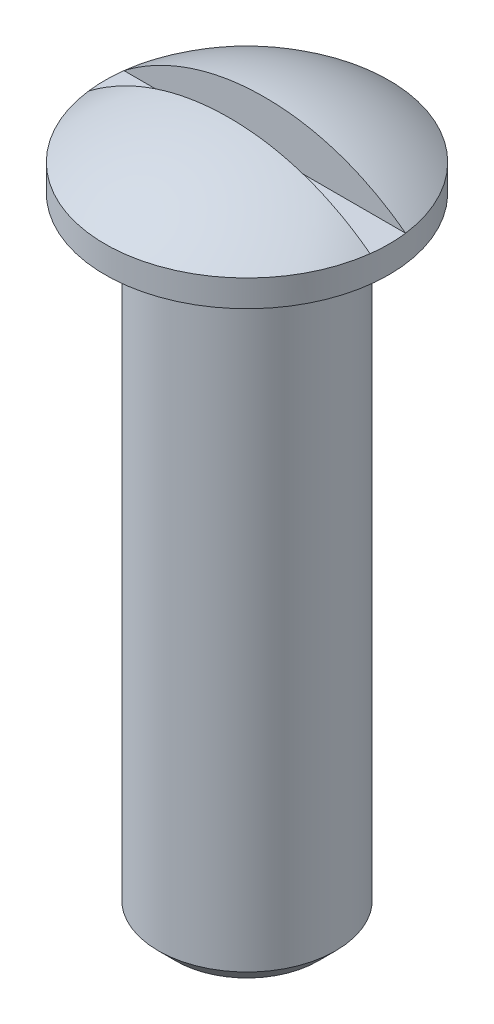
ISO-10303-21;
HEADER;
FILE_DESCRIPTION(('STEP AP214'),'2;1');
FILE_NAME('part.step','',(''),(''),'','','');
FILE_SCHEMA(('AUTOMOTIVE_DESIGN { 1 0 10303 214 1 1 1 1 }'));
ENDSEC;
DATA;
#1=APPLICATION_CONTEXT('core data for automotive mechanical design processes');
#2=APPLICATION_PROTOCOL_DEFINITION('international standard','automotive_design',2000,#1);
#3=PRODUCT_CONTEXT('',#1,'mechanical');
#4=PRODUCT('Part','Part','',(#3));
#5=PRODUCT_RELATED_PRODUCT_CATEGORY('part','',(#4));
#6=PRODUCT_DEFINITION_FORMATION('','',#4);
#7=PRODUCT_DEFINITION_CONTEXT('part definition',#1,'design');
#8=PRODUCT_DEFINITION('design','',#6,#7);
#9=PRODUCT_DEFINITION_SHAPE('','',#8);
#10=(LENGTH_UNIT() NAMED_UNIT(*) SI_UNIT(.MILLI.,.METRE.));
#11=(NAMED_UNIT(*) PLANE_ANGLE_UNIT() SI_UNIT($,.RADIAN.));
#12=(NAMED_UNIT(*) SI_UNIT($,.STERADIAN.) SOLID_ANGLE_UNIT());
#13=UNCERTAINTY_MEASURE_WITH_UNIT(LENGTH_MEASURE(1.E-05),#10,'distance_accuracy_value','');
#14=(GEOMETRIC_REPRESENTATION_CONTEXT(3) GLOBAL_UNCERTAINTY_ASSIGNED_CONTEXT((#13)) GLOBAL_UNIT_ASSIGNED_CONTEXT((#10,
#11,#12)) REPRESENTATION_CONTEXT('',''));
#15=CARTESIAN_POINT('',(0.,0.,0.));
#16=DIRECTION('',(0.,0.,1.));
#17=DIRECTION('',(1.,0.,0.));
#18=AXIS2_PLACEMENT_3D('',#15,#16,#17);
#19=CARTESIAN_POINT('',(0.,26.7001788182341,0.));
#20=DIRECTION('',(0.,-1.,0.));
#21=DIRECTION('',(1.,0.,0.));
#22=AXIS2_PLACEMENT_3D('',#19,#20,#21);
#23=DEGENERATE_TOROIDAL_SURFACE('',#22,0.0681853511540249,13.,.T.);
#24=CARTESIAN_POINT('',(0.,37.,0.));
#25=DIRECTION('',(0.,-1.,0.));
#26=DIRECTION('',(1.,0.,0.));
#27=AXIS2_PLACEMENT_3D('',#24,#25,#26);
#28=CIRCLE('',#27,8.);
#29=CARTESIAN_POINT('',(-7.93725393319377,37.,-0.99999999999999));
#30=VERTEX_POINT('',#29);
#31=CARTESIAN_POINT('',(7.93725393319377,37.,-1.));
#32=VERTEX_POINT('',#31);
#33=EDGE_CURVE('E96',#30,#32,#28,.T.);
#34=ORIENTED_EDGE('',*,*,#33,.F.);
#35=CARTESIAN_POINT('',(-11.5955884343701,20.7735568842803,-0.999999999999988));
#36=CARTESIAN_POINT('',(-11.7504543959535,21.0747175937025,-0.999999999999988));
#37=CARTESIAN_POINT('',(-11.8934649747058,21.3819681700214,-0.999999999999988));
#38=CARTESIAN_POINT('',(-12.1550036979689,22.0066856029269,-0.999999999999988));
#39=CARTESIAN_POINT('',(-12.2735341060582,22.3241515118044,-0.999999999999988));
#40=CARTESIAN_POINT('',(-12.4853594784374,22.9673613933858,-0.999999999999988));
#41=CARTESIAN_POINT('',(-12.5786568895041,23.2931045601125,-0.999999999999987));
#42=CARTESIAN_POINT('',(-12.7394709562751,23.9509052297831,-0.999999999999987));
#43=CARTESIAN_POINT('',(-12.8069862709557,24.2829630602334,-0.999999999999987));
#44=CARTESIAN_POINT('',(-12.9199617626316,24.9768406525739,-0.999999999999987));
#45=CARTESIAN_POINT('',(-12.9633487172013,25.3389998147488,-0.999999999999987));
#46=CARTESIAN_POINT('',(-13.0194582584367,26.0656887723323,-0.999999999999987));
#47=CARTESIAN_POINT('',(-13.0321800022219,26.4302186326269,-0.999999999999987));
#48=CARTESIAN_POINT('',(-13.0268684335726,27.1590332231517,-0.999999999999987));
#49=CARTESIAN_POINT('',(-13.0088370481099,27.5233179673098,-0.999999999999987));
#50=CARTESIAN_POINT('',(-12.9421510824588,28.2490674187462,-0.999999999999987));
#51=CARTESIAN_POINT('',(-12.8934969803872,28.6105321699642,-0.999999999999987));
#52=CARTESIAN_POINT('',(-12.7659128451296,29.3280740617672,-0.999999999999987));
#53=CARTESIAN_POINT('',(-12.6869831764751,29.6841512671671,-0.999999999999987));
#54=CARTESIAN_POINT('',(-12.4994085889598,30.388392558344,-0.999999999999987));
#55=CARTESIAN_POINT('',(-12.3907635460108,30.73655661107,-0.999999999999988));
#56=CARTESIAN_POINT('',(-12.1445210301726,31.4225222535012,-0.999999999999988));
#57=CARTESIAN_POINT('',(-12.0069212684727,31.76032302159,-0.999999999999988));
#58=CARTESIAN_POINT('',(-11.7037530189888,32.4231313634633,-0.999999999999988));
#59=CARTESIAN_POINT('',(-11.5381845522863,32.7481389468906,-0.999999999999988));
#60=CARTESIAN_POINT('',(-11.1802676463808,33.3830301135749,-0.999999999999989));
#61=CARTESIAN_POINT('',(-10.9879209290589,33.6929146675363,-0.999999999999989));
#62=CARTESIAN_POINT('',(-10.5778072061844,34.2953790746547,-0.999999999999989));
#63=CARTESIAN_POINT('',(-10.3600402246068,34.5879589441323,-0.999999999999989));
#64=CARTESIAN_POINT('',(-9.90062050278355,35.1537514201305,-0.999999999999989));
#65=CARTESIAN_POINT('',(-9.65896634883837,35.4269628787376,-0.999999999999989));
#66=CARTESIAN_POINT('',(-9.15350044626575,35.9520584755209,-0.99999999999999));
#67=CARTESIAN_POINT('',(-8.88968860982872,36.20394252917,-0.99999999999999));
#68=CARTESIAN_POINT('',(-8.34174540828675,36.6846259177286,-0.99999999999999));
#69=CARTESIAN_POINT('',(-8.05761118123079,36.9134219902347,-0.99999999999999));
#70=CARTESIAN_POINT('',(-7.47107729304526,37.3462629736812,-0.999999999999991));
#71=CARTESIAN_POINT('',(-7.16867762947116,37.550307881309,-0.999999999999991));
#72=CARTESIAN_POINT('',(-6.54786011453824,37.932138022264,-0.999999999999991));
#73=CARTESIAN_POINT('',(-6.22944726010165,38.1099313800671,-0.999999999999991));
#74=CARTESIAN_POINT('',(-5.57877084116923,38.4380794170028,-0.999999999999992));
#75=CARTESIAN_POINT('',(-5.24650680446524,38.5884331597355,-0.999999999999992));
#76=CARTESIAN_POINT('',(-4.57050127659127,38.8606304735858,-0.999999999999992));
#77=CARTESIAN_POINT('',(-4.22675994803084,38.9824744484324,-0.999999999999992));
#78=CARTESIAN_POINT('',(-3.53028817283792,39.1967948920967,-0.999999999999993));
#79=CARTESIAN_POINT('',(-3.1775585323128,39.2892739845296,-0.999999999999993));
#80=CARTESIAN_POINT('',(-2.46535604215314,39.4442986570593,-0.999999999999994));
#81=CARTESIAN_POINT('',(-2.10588001487638,39.506829743814,-0.999999999999994));
#82=CARTESIAN_POINT('',(-1.56376674113908,39.5779154773945,-0.999999999999994));
#83=CARTESIAN_POINT('',(-1.38254716231654,39.5978270675631,-0.999999999999994));
#84=CARTESIAN_POINT('',(-1.01942520345842,39.6301207875538,-0.999999999999994));
#85=CARTESIAN_POINT('',(-0.837522815091205,39.6425028251981,-0.999999999999994));
#86=CARTESIAN_POINT('',(-0.472379802575064,39.6599324350426,-0.999999999999995));
#87=CARTESIAN_POINT('',(-0.289137288166324,39.6649396646644,-0.999999999999995));
#88=CARTESIAN_POINT('',(0.077403383586244,39.6677357030268,-0.999999999999995));
#89=CARTESIAN_POINT('',(0.260701541439752,39.6655244435227,-0.999999999999995));
#90=CARTESIAN_POINT('',(0.627054646819594,39.653747097865,-0.999999999999995));
#91=CARTESIAN_POINT('',(0.810109611171982,39.6441815502738,-0.999999999999995));
#92=CARTESIAN_POINT('',(1.17565159007584,39.6174761988344,-0.999999999999996));
#93=CARTESIAN_POINT('',(1.35813861795779,39.6003365741343,-0.999999999999996));
#94=CARTESIAN_POINT('',(1.90417364414901,39.537453425434,-0.999999999999996));
#95=CARTESIAN_POINT('',(2.26647375849857,39.4802401394231,-0.999999999999996));
#96=CARTESIAN_POINT('',(2.98490508633616,39.3354091518134,-0.999999999999997));
#97=CARTESIAN_POINT('',(3.34103615262673,39.2477907257745,-0.999999999999997));
#98=CARTESIAN_POINT('',(4.05156637159401,39.040709371125,-0.999999999999997));
#99=CARTESIAN_POINT('',(4.40579284212522,38.9206524750335,-0.999999999999998));
#100=CARTESIAN_POINT('',(5.1025663374046,38.6504018799969,-0.999999999999998));
#101=CARTESIAN_POINT('',(5.44511293453311,38.500207079036,-0.999999999999998));
#102=CARTESIAN_POINT('',(6.11602373120545,38.1707663062648,-0.999999999999999));
#103=CARTESIAN_POINT('',(6.44438513396123,37.99151463834,-0.999999999999999));
#104=CARTESIAN_POINT('',(7.084388270057,37.6053213708752,-0.999999999999999));
#105=CARTESIAN_POINT('',(7.39603052403115,37.3983806342747,-0.999999999999999));
#106=CARTESIAN_POINT('',(7.99287542125923,36.9637410022009,-1.));
#107=CARTESIAN_POINT('',(8.27853837584292,36.7366738040048,-1.));
#108=CARTESIAN_POINT('',(8.82970952519452,36.2592741618172,-1.));
#109=CARTESIAN_POINT('',(9.09521800260768,36.0089420442012,-1.));
#110=CARTESIAN_POINT('',(9.60416298872166,35.4868221152236,-1.));
#111=CARTESIAN_POINT('',(9.84760202419754,35.2150367667683,-1.));
#112=CARTESIAN_POINT('',(10.3107115922265,34.651917227806,-1.));
#113=CARTESIAN_POINT('',(10.5303820575614,34.3605829820181,-1.));
#114=CARTESIAN_POINT('',(10.9443320161815,33.7605235653455,-1.));
#115=CARTESIAN_POINT('',(11.1386186479641,33.4518033188909,-1.));
#116=CARTESIAN_POINT('',(11.5004919715394,32.8190921501795,-1.));
#117=CARTESIAN_POINT('',(11.6680786741124,32.4951012340885,-1.));
#118=CARTESIAN_POINT('',(11.9753521163661,31.8341701689345,-1.));
#119=CARTESIAN_POINT('',(12.1150403621393,31.4972307200669,-1.));
#120=CARTESIAN_POINT('',(12.3655346927046,30.8127823337585,-1.));
#121=CARTESIAN_POINT('',(12.4763408396452,30.4652734190628,-1.));
#122=CARTESIAN_POINT('',(12.6682603099672,29.7622409852329,-1.));
#123=CARTESIAN_POINT('',(12.7493807873839,29.4067194190446,-1.));
#124=CARTESIAN_POINT('',(12.8813904628838,28.6901039889313,-1.));
#125=CARTESIAN_POINT('',(12.9322793904291,28.3290100751699,-1.));
#126=CARTESIAN_POINT('',(13.0034791523473,27.603656386151,-1.));
#127=CARTESIAN_POINT('',(13.0237762579251,27.2393952632418,-1.));
#128=CARTESIAN_POINT('',(13.0336041992196,26.5104712536356,-1.));
#129=CARTESIAN_POINT('',(13.0231361488493,26.1458083819625,-1.));
#130=CARTESIAN_POINT('',(12.9714910032388,25.4183774366766,-1.));
#131=CARTESIAN_POINT('',(12.9302898602662,25.0556110709821,-1.));
#132=CARTESIAN_POINT('',(12.81744238323,24.3348445953191,-1.));
#133=CARTESIAN_POINT('',(12.7457963547695,23.9768444375451,-1.));
#134=CARTESIAN_POINT('',(12.5727239177069,23.2687707459698,-1.));
#135=CARTESIAN_POINT('',(12.4713477700459,22.9186848996589,-1.));
#136=CARTESIAN_POINT('',(12.2395254022263,22.228439004801,-1.));
#137=CARTESIAN_POINT('',(12.1090961011791,21.8882733091132,-1.));
#138=CARTESIAN_POINT('',(11.9074475159069,21.4220763863337,-1.));
#139=CARTESIAN_POINT('',(11.8480594580016,21.2908286011322,-1.));
#140=CARTESIAN_POINT('',(11.7250191241376,21.0305479269245,-1.));
#141=CARTESIAN_POINT('',(11.6613722703999,20.9015124747342,-1.));
#142=CARTESIAN_POINT('',(11.5955884343701,20.7735568842803,-1.));
#143=B_SPLINE_CURVE_WITH_KNOTS('',3,(#35,#36,#37,#38,#39,#40,#41,#42,#43,#44,#45,#46,#47,#48,
#49,#50,#51,#52,#53,#54,#55,#56,#57,#58,#59,#60,#61,#62,#63,#64,#65,#66,#67,#68,#69,#70,#71,#72,
#73,#74,#75,#76,#77,#78,#79,#80,#81,#82,#83,#84,#85,#86,#87,#88,#89,#90,#91,#92,#93,#94,#95,#96,
#97,#98,#99,#100,#101,#102,#103,#104,#105,#106,#107,#108,#109,#110,#111,#112,#113,#114,#115,
#116,#117,#118,#119,#120,#121,#122,#123,#124,#125,#126,#127,#128,#129,#130,#131,#132,#133,#134,
#135,#136,#137,#138,#139,#140,#141,#142),.UNSPECIFIED.,.F.,.F.,(4,2,2,2,2,2,2,2,2,2,2,2,2,2,2,2,
2,2,2,2,2,2,2,2,2,2,2,2,2,2,2,2,2,2,2,2,2,2,2,2,2,2,2,2,2,2,2,2,2,2,2,2,2,4),(0.,
1.01567046789848,2.03124697893343,3.04672497686609,4.06225578642939,5.15518879692076,
6.24815184801916,7.34104641725118,8.43392392338688,9.52678827119206,10.6196571827503,
11.712612515809,12.8055670250452,13.8984512881185,14.9913345204523,16.0842824709772,
17.1772347529947,18.2703412569396,19.3634479071793,20.4562155443853,21.5490204662413,
22.6418099118714,23.7345016943749,24.8277217522244,25.3745230842603,25.9213311101867,
26.4711193836557,27.0209128549261,27.5706660680636,28.1204062787007,29.2193536032002,
30.3183271132721,31.438974967045,32.5596638056481,33.6805726028928,34.8014464747614,
35.8948986249016,36.9883354376957,38.0816469021737,39.1749614584847,40.2679678856183,
41.360973871446,42.4539208356156,43.5468654479685,44.6395464947177,45.73223731957,
46.8254183691084,47.9185598383619,49.012557556789,50.1065442940214,51.1986921245484,
52.2902055975872,52.7223186457665,53.153891635408),.UNSPECIFIED.);
#144=EDGE_CURVE('E13',#30,#32,#143,.T.);
#145=ORIENTED_EDGE('',*,*,#144,.T.);
#146=EDGE_LOOP('',(#34,#145));
#147=FACE_BOUND('',#146,.T.);
#148=ADVANCED_FACE('F57',(#147),#23,.T.);
#149=CARTESIAN_POINT('',(7.93725393319377,37.,1.));
#150=VERTEX_POINT('',#149);
#151=CARTESIAN_POINT('',(-7.93725393319377,37.,1.));
#152=VERTEX_POINT('',#151);
#153=EDGE_CURVE('E95',#150,#152,#28,.T.);
#154=ORIENTED_EDGE('',*,*,#153,.F.);
#155=CARTESIAN_POINT('',(11.5955884343701,20.7735568842803,1.));
#156=CARTESIAN_POINT('',(11.7504543959535,21.0747175937025,1.));
#157=CARTESIAN_POINT('',(11.8934649747058,21.3819681700214,1.));
#158=CARTESIAN_POINT('',(12.1550036979689,22.0066856029269,1.));
#159=CARTESIAN_POINT('',(12.2735341060582,22.3241515118044,1.));
#160=CARTESIAN_POINT('',(12.4853594784374,22.9673613933858,1.));
#161=CARTESIAN_POINT('',(12.5786568895041,23.2931045601125,1.));
#162=CARTESIAN_POINT('',(12.7394709562751,23.9509052297831,1.));
#163=CARTESIAN_POINT('',(12.8069862709557,24.2829630602334,1.));
#164=CARTESIAN_POINT('',(12.9199617626316,24.9768406525739,1.));
#165=CARTESIAN_POINT('',(12.9633487172013,25.3389998147488,1.));
#166=CARTESIAN_POINT('',(13.0194582584367,26.0656887723323,1.));
#167=CARTESIAN_POINT('',(13.0321800022219,26.4302186326269,1.));
#168=CARTESIAN_POINT('',(13.0268684335726,27.1590332231517,1.));
#169=CARTESIAN_POINT('',(13.0088370481099,27.5233179673098,1.));
#170=CARTESIAN_POINT('',(12.9421510824588,28.2490674187462,1.));
#171=CARTESIAN_POINT('',(12.8934969803872,28.6105321699642,1.));
#172=CARTESIAN_POINT('',(12.7659128451296,29.3280740617672,1.));
#173=CARTESIAN_POINT('',(12.6869831764751,29.6841512671671,1.));
#174=CARTESIAN_POINT('',(12.4994085889598,30.388392558344,1.));
#175=CARTESIAN_POINT('',(12.3907635460108,30.73655661107,1.));
#176=CARTESIAN_POINT('',(12.1445210301726,31.4225222535012,1.));
#177=CARTESIAN_POINT('',(12.0069212684727,31.76032302159,1.));
#178=CARTESIAN_POINT('',(11.7037530189888,32.4231313634633,1.));
#179=CARTESIAN_POINT('',(11.5381845522863,32.7481389468906,1.));
#180=CARTESIAN_POINT('',(11.1802676463808,33.3830301135749,1.));
#181=CARTESIAN_POINT('',(10.9879209290589,33.6929146675363,1.));
#182=CARTESIAN_POINT('',(10.5778072061844,34.2953790746547,1.));
#183=CARTESIAN_POINT('',(10.3600402246068,34.5879589441323,1.));
#184=CARTESIAN_POINT('',(9.90062050278355,35.1537514201305,1.));
#185=CARTESIAN_POINT('',(9.65896634883837,35.4269628787376,1.));
#186=CARTESIAN_POINT('',(9.15350044626575,35.9520584755209,1.));
#187=CARTESIAN_POINT('',(8.88968860982872,36.20394252917,1.));
#188=CARTESIAN_POINT('',(8.34174540828675,36.6846259177286,1.));
#189=CARTESIAN_POINT('',(8.05761118123079,36.9134219902347,1.));
#190=CARTESIAN_POINT('',(7.47107729304526,37.3462629736812,1.));
#191=CARTESIAN_POINT('',(7.16867762947116,37.5503078813089,1.));
#192=CARTESIAN_POINT('',(6.54786011453825,37.932138022264,1.));
#193=CARTESIAN_POINT('',(6.22944726010166,38.1099313800671,1.));
#194=CARTESIAN_POINT('',(5.57877084116924,38.4380794170028,1.));
#195=CARTESIAN_POINT('',(5.24650680446524,38.5884331597355,1.));
#196=CARTESIAN_POINT('',(4.57050127659128,38.8606304735858,1.));
#197=CARTESIAN_POINT('',(4.22675994803085,38.9824744484324,1.));
#198=CARTESIAN_POINT('',(3.53028817283793,39.1967948920967,1.));
#199=CARTESIAN_POINT('',(3.17755853231281,39.2892739845296,1.));
#200=CARTESIAN_POINT('',(2.46535604215314,39.4442986570593,1.));
#201=CARTESIAN_POINT('',(2.10588001487638,39.506829743814,1.));
#202=CARTESIAN_POINT('',(1.56376674113908,39.5779154773945,1.));
#203=CARTESIAN_POINT('',(1.38254716231655,39.5978270675631,1.));
#204=CARTESIAN_POINT('',(1.01942520345843,39.6301207875538,1.));
#205=CARTESIAN_POINT('',(0.837522815091209,39.6425028251981,1.));
#206=CARTESIAN_POINT('',(0.472379802575068,39.6599324350426,1.));
#207=CARTESIAN_POINT('',(0.289137288166328,39.6649396646644,1.));
#208=CARTESIAN_POINT('',(-0.0774033835862396,39.6677357030268,1.));
#209=CARTESIAN_POINT('',(-0.260701541439748,39.6655244435227,1.));
#210=CARTESIAN_POINT('',(-0.627054646819589,39.653747097865,1.));
#211=CARTESIAN_POINT('',(-0.810109611171977,39.6441815502738,1.));
#212=CARTESIAN_POINT('',(-1.17565159007584,39.6174761988344,1.));
#213=CARTESIAN_POINT('',(-1.35813861795779,39.6003365741343,1.));
#214=CARTESIAN_POINT('',(-1.90417364414901,39.537453425434,1.));
#215=CARTESIAN_POINT('',(-2.26647375849857,39.4802401394231,1.));
#216=CARTESIAN_POINT('',(-2.98490508633616,39.3354091518134,1.));
#217=CARTESIAN_POINT('',(-3.34103615262673,39.2477907257745,1.));
#218=CARTESIAN_POINT('',(-4.05156637159401,39.040709371125,1.));
#219=CARTESIAN_POINT('',(-4.40579284212521,38.9206524750335,1.));
#220=CARTESIAN_POINT('',(-5.10256633740459,38.6504018799969,1.));
#221=CARTESIAN_POINT('',(-5.44511293453311,38.500207079036,1.));
#222=CARTESIAN_POINT('',(-6.11602373120545,38.1707663062648,1.));
#223=CARTESIAN_POINT('',(-6.44438513396123,37.99151463834,1.));
#224=CARTESIAN_POINT('',(-7.084388270057,37.6053213708752,1.));
#225=CARTESIAN_POINT('',(-7.39603052403115,37.3983806342747,1.));
#226=CARTESIAN_POINT('',(-7.99287542125923,36.9637410022009,1.));
#227=CARTESIAN_POINT('',(-8.27853837584292,36.7366738040048,1.));
#228=CARTESIAN_POINT('',(-8.82970952519452,36.2592741618172,1.));
#229=CARTESIAN_POINT('',(-9.09521800260768,36.0089420442012,1.));
#230=CARTESIAN_POINT('',(-9.60416298872166,35.4868221152236,1.));
#231=CARTESIAN_POINT('',(-9.84760202419753,35.2150367667683,1.));
#232=CARTESIAN_POINT('',(-10.3107115922265,34.651917227806,1.));
#233=CARTESIAN_POINT('',(-10.5303820575614,34.3605829820181,1.));
#234=CARTESIAN_POINT('',(-10.9443320161815,33.7605235653455,1.));
#235=CARTESIAN_POINT('',(-11.1386186479641,33.4518033188909,1.));
#236=CARTESIAN_POINT('',(-11.5004919715394,32.8190921501795,1.));
#237=CARTESIAN_POINT('',(-11.6680786741124,32.4951012340885,1.));
#238=CARTESIAN_POINT('',(-11.9753521163661,31.8341701689345,1.));
#239=CARTESIAN_POINT('',(-12.1150403621393,31.497230720067,1.));
#240=CARTESIAN_POINT('',(-12.3655346927046,30.8127823337585,1.));
#241=CARTESIAN_POINT('',(-12.4763408396452,30.4652734190628,1.));
#242=CARTESIAN_POINT('',(-12.6682603099672,29.7622409852329,1.));
#243=CARTESIAN_POINT('',(-12.7493807873839,29.4067194190446,1.));
#244=CARTESIAN_POINT('',(-12.8813904628838,28.6901039889313,1.));
#245=CARTESIAN_POINT('',(-12.9322793904291,28.3290100751699,1.));
#246=CARTESIAN_POINT('',(-13.0034791523473,27.603656386151,1.));
#247=CARTESIAN_POINT('',(-13.0237762579251,27.2393952632418,1.));
#248=CARTESIAN_POINT('',(-13.0336041992196,26.5104712536356,1.));
#249=CARTESIAN_POINT('',(-13.0231361488493,26.1458083819625,1.));
#250=CARTESIAN_POINT('',(-12.9714910032388,25.4183774366766,1.));
#251=CARTESIAN_POINT('',(-12.9302898602662,25.0556110709821,1.));
#252=CARTESIAN_POINT('',(-12.81744238323,24.3348445953191,1.));
#253=CARTESIAN_POINT('',(-12.7457963547695,23.9768444375451,1.));
#254=CARTESIAN_POINT('',(-12.5727239177069,23.2687707459698,1.));
#255=CARTESIAN_POINT('',(-12.4713477700459,22.9186848996589,1.));
#256=CARTESIAN_POINT('',(-12.2395254022263,22.228439004801,1.));
#257=CARTESIAN_POINT('',(-12.1090961011791,21.8882733091132,1.));
#258=CARTESIAN_POINT('',(-11.9074475159069,21.4220763863337,1.));
#259=CARTESIAN_POINT('',(-11.8480594580016,21.2908286011322,1.));
#260=CARTESIAN_POINT('',(-11.7250191241376,21.0305479269245,1.));
#261=CARTESIAN_POINT('',(-11.6613722703999,20.9015124747342,1.));
#262=CARTESIAN_POINT('',(-11.5955884343701,20.7735568842803,1.));
#263=B_SPLINE_CURVE_WITH_KNOTS('',3,(#155,#156,#157,#158,#159,#160,#161,#162,#163,#164,#165,
#166,#167,#168,#169,#170,#171,#172,#173,#174,#175,#176,#177,#178,#179,#180,#181,#182,#183,#184,
#185,#186,#187,#188,#189,#190,#191,#192,#193,#194,#195,#196,#197,#198,#199,#200,#201,#202,#203,
#204,#205,#206,#207,#208,#209,#210,#211,#212,#213,#214,#215,#216,#217,#218,#219,#220,#221,#222,
#223,#224,#225,#226,#227,#228,#229,#230,#231,#232,#233,#234,#235,#236,#237,#238,#239,#240,#241,
#242,#243,#244,#245,#246,#247,#248,#249,#250,#251,#252,#253,#254,#255,#256,#257,#258,#259,#260,
#261,#262),.UNSPECIFIED.,.F.,.F.,(4,2,2,2,2,2,2,2,2,2,2,2,2,2,2,2,2,2,2,2,2,2,2,2,2,2,2,2,2,2,2,
2,2,2,2,2,2,2,2,2,2,2,2,2,2,2,2,2,2,2,2,2,2,4),(0.,1.01567046789848,2.03124697893343,
3.04672497686609,4.06225578642939,5.15518879692076,6.24815184801916,7.34104641725118,
8.43392392338688,9.52678827119206,10.6196571827503,11.712612515809,12.8055670250452,
13.8984512881185,14.9913345204523,16.0842824709772,17.1772347529947,18.2703412569396,
19.3634479071793,20.4562155443853,21.5490204662413,22.6418099118714,23.7345016943749,
24.8277217522244,25.3745230842603,25.9213311101867,26.4711193836557,27.0209128549261,
27.5706660680636,28.1204062787007,29.2193536032002,30.3183271132721,31.438974967045,
32.5596638056481,33.6805726028928,34.8014464747614,35.8948986249016,36.9883354376957,
38.0816469021737,39.1749614584847,40.2679678856183,41.360973871446,42.4539208356156,
43.5468654479685,44.6395464947177,45.73223731957,46.8254183691084,47.918559838362,
49.012557556789,50.1065442940214,51.1986921245484,52.2902055975872,52.7223186457665,
53.153891635408),.UNSPECIFIED.);
#264=EDGE_CURVE('E71',#150,#152,#263,.T.);
#265=ORIENTED_EDGE('',*,*,#264,.T.);
#266=EDGE_LOOP('',(#154,#265));
#267=FACE_BOUND('',#266,.T.);
#268=ADVANCED_FACE('F105',(#267),#23,.T.);
#269=CARTESIAN_POINT('',(0.,0.,0.));
#270=DIRECTION('',(0.,-1.,0.));
#271=DIRECTION('',(1.,0.,0.));
#272=AXIS2_PLACEMENT_3D('',#269,#270,#271);
#273=CYLINDRICAL_SURFACE('',#272,8.);
#274=EDGE_CURVE('E110',#32,#150,#28,.T.);
#275=ORIENTED_EDGE('',*,*,#274,.T.);
#276=ORIENTED_EDGE('',*,*,#153,.T.);
#277=EDGE_CURVE('E85',#152,#30,#28,.T.);
#278=ORIENTED_EDGE('',*,*,#277,.T.);
#279=ORIENTED_EDGE('',*,*,#33,.T.);
#280=EDGE_LOOP('',(#275,#276,#278,#279));
#281=FACE_BOUND('',#280,.T.);
#282=CARTESIAN_POINT('',(0.,35.5,0.));
#283=DIRECTION('',(0.,-1.,0.));
#284=DIRECTION('',(1.,0.,0.));
#285=AXIS2_PLACEMENT_3D('',#282,#283,#284);
#286=CIRCLE('',#285,8.);
#287=CARTESIAN_POINT('',(8.,35.5,0.));
#288=VERTEX_POINT('',#287);
#289=EDGE_CURVE('E114',#288,#288,#286,.T.);
#290=ORIENTED_EDGE('',*,*,#289,.F.);
#291=EDGE_LOOP('',(#290));
#292=FACE_BOUND('',#291,.T.);
#293=ADVANCED_FACE('F108',(#281,#292),#273,.T.);
#294=CARTESIAN_POINT('',(4.99999999999999,35.5,0.));
#295=DIRECTION('',(0.,-1.,0.));
#296=DIRECTION('',(1.,0.,0.));
#297=AXIS2_PLACEMENT_3D('',#294,#295,#296);
#298=PLANE('',#297);
#299=ORIENTED_EDGE('',*,*,#289,.T.);
#300=EDGE_LOOP('',(#299));
#301=FACE_BOUND('',#300,.T.);
#302=CARTESIAN_POINT('',(0.,35.5,0.));
#303=DIRECTION('',(0.,-1.,0.));
#304=DIRECTION('',(1.,0.,0.));
#305=AXIS2_PLACEMENT_3D('',#302,#303,#304);
#306=CIRCLE('',#305,4.99999999999999);
#307=CARTESIAN_POINT('',(4.99999999999999,35.5,0.));
#308=VERTEX_POINT('',#307);
#309=EDGE_CURVE('E102',#308,#308,#306,.T.);
#310=ORIENTED_EDGE('',*,*,#309,.F.);
#311=EDGE_LOOP('',(#310));
#312=FACE_BOUND('',#311,.T.);
#313=ADVANCED_FACE('F141',(#301,#312),#298,.T.);
#314=CARTESIAN_POINT('',(0.,0.,0.));
#315=DIRECTION('',(0.,-1.,0.));
#316=DIRECTION('',(1.,0.,0.));
#317=AXIS2_PLACEMENT_3D('',#314,#315,#316);
#318=CYLINDRICAL_SURFACE('',#317,5.);
#319=CARTESIAN_POINT('',(0.,0.999999999999996,0.));
#320=DIRECTION('',(0.,-1.,0.));
#321=DIRECTION('',(1.,0.,0.));
#322=AXIS2_PLACEMENT_3D('',#319,#320,#321);
#323=CIRCLE('',#322,5.);
#324=CARTESIAN_POINT('',(5.,0.999999999999996,0.));
#325=VERTEX_POINT('',#324);
#326=EDGE_CURVE('E107',#325,#325,#323,.F.);
#327=ORIENTED_EDGE('',*,*,#326,.T.);
#328=EDGE_LOOP('',(#327));
#329=FACE_BOUND('',#328,.T.);
#330=ORIENTED_EDGE('',*,*,#309,.T.);
#331=EDGE_LOOP('',(#330));
#332=FACE_BOUND('',#331,.T.);
#333=ADVANCED_FACE('F137',(#329,#332),#318,.T.);
#334=CARTESIAN_POINT('',(0.,0.,0.));
#335=DIRECTION('',(0.,-1.,0.));
#336=DIRECTION('',(1.,0.,0.));
#337=AXIS2_PLACEMENT_3D('',#334,#335,#336);
#338=PLANE('',#337);
#339=CARTESIAN_POINT('',(0.,0.,0.));
#340=DIRECTION('',(0.,-1.,0.));
#341=DIRECTION('',(1.,0.,0.));
#342=AXIS2_PLACEMENT_3D('',#339,#340,#341);
#343=CIRCLE('',#342,4.);
#344=CARTESIAN_POINT('',(4.,0.,0.));
#345=VERTEX_POINT('',#344);
#346=EDGE_CURVE('E111',#345,#345,#343,.T.);
#347=ORIENTED_EDGE('',*,*,#346,.T.);
#348=EDGE_LOOP('',(#347));
#349=FACE_BOUND('',#348,.T.);
#350=ADVANCED_FACE('F134',(#349),#338,.T.);
#351=CARTESIAN_POINT('',(0.,0.,0.));
#352=DIRECTION('',(0.,1.,0.));
#353=DIRECTION('',(-1.,0.,0.));
#354=AXIS2_PLACEMENT_3D('',#351,#352,#353);
#355=CONICAL_SURFACE('',#354,4.,0.785398163397447);
#356=ORIENTED_EDGE('',*,*,#326,.F.);
#357=EDGE_LOOP('',(#356));
#358=FACE_BOUND('',#357,.T.);
#359=ORIENTED_EDGE('',*,*,#346,.F.);
#360=EDGE_LOOP('',(#359));
#361=FACE_BOUND('',#360,.T.);
#362=ADVANCED_FACE('F60',(#358,#361),#355,.T.);
#363=CARTESIAN_POINT('',(-8.,39.7001788182341,-0.99999999999999));
#364=DIRECTION('',(0.,0.,1.));
#365=DIRECTION('',(1.,0.,0.));
#366=AXIS2_PLACEMENT_3D('',#363,#364,#365);
#367=PLANE('',#366);
#368=DIRECTION('',(-1.,0.,0.));
#369=VECTOR('',#368,1.);
#370=CARTESIAN_POINT('',(-8.,37.,-0.99999999999999));
#371=LINE('',#370,#369);
#372=EDGE_CURVE('E93',#32,#30,#371,.T.);
#373=ORIENTED_EDGE('',*,*,#372,.F.);
#374=ORIENTED_EDGE('',*,*,#144,.F.);
#375=EDGE_LOOP('',(#373,#374));
#376=FACE_BOUND('',#375,.T.);
#377=ADVANCED_FACE('F129',(#376),#367,.T.);
#378=CARTESIAN_POINT('',(-8.,39.7001788182341,1.));
#379=DIRECTION('',(0.,0.,-1.));
#380=DIRECTION('',(-1.,0.,0.));
#381=AXIS2_PLACEMENT_3D('',#378,#379,#380);
#382=PLANE('',#381);
#383=DIRECTION('',(1.,0.,0.));
#384=VECTOR('',#383,1.);
#385=CARTESIAN_POINT('',(-8.,37.,1.));
#386=LINE('',#385,#384);
#387=EDGE_CURVE('E78',#152,#150,#386,.T.);
#388=ORIENTED_EDGE('',*,*,#387,.F.);
#389=ORIENTED_EDGE('',*,*,#264,.F.);
#390=EDGE_LOOP('',(#388,#389));
#391=FACE_BOUND('',#390,.T.);
#392=ADVANCED_FACE('F100',(#391),#382,.T.);
#393=CARTESIAN_POINT('',(0.,37.,0.));
#394=DIRECTION('',(0.,1.,0.));
#395=DIRECTION('',(0.,0.,1.));
#396=AXIS2_PLACEMENT_3D('',#393,#394,#395);
#397=PLANE('',#396);
#398=ORIENTED_EDGE('',*,*,#387,.T.);
#399=ORIENTED_EDGE('',*,*,#274,.F.);
#400=ORIENTED_EDGE('',*,*,#372,.T.);
#401=ORIENTED_EDGE('',*,*,#277,.F.);
#402=EDGE_LOOP('',(#398,#399,#400,#401));
#403=FACE_BOUND('',#402,.T.);
#404=ADVANCED_FACE('F91',(#403),#397,.T.);
#405=CLOSED_SHELL('',(#148,#268,#293,#313,#333,#350,#362,#377,#392,#404));
#406=MANIFOLD_SOLID_BREP('B2',#405);
#407=ADVANCED_BREP_SHAPE_REPRESENTATION('',(#18,#406),#14);
#408=SHAPE_DEFINITION_REPRESENTATION(#9,#407);
ENDSEC;
END-ISO-10303-21;
